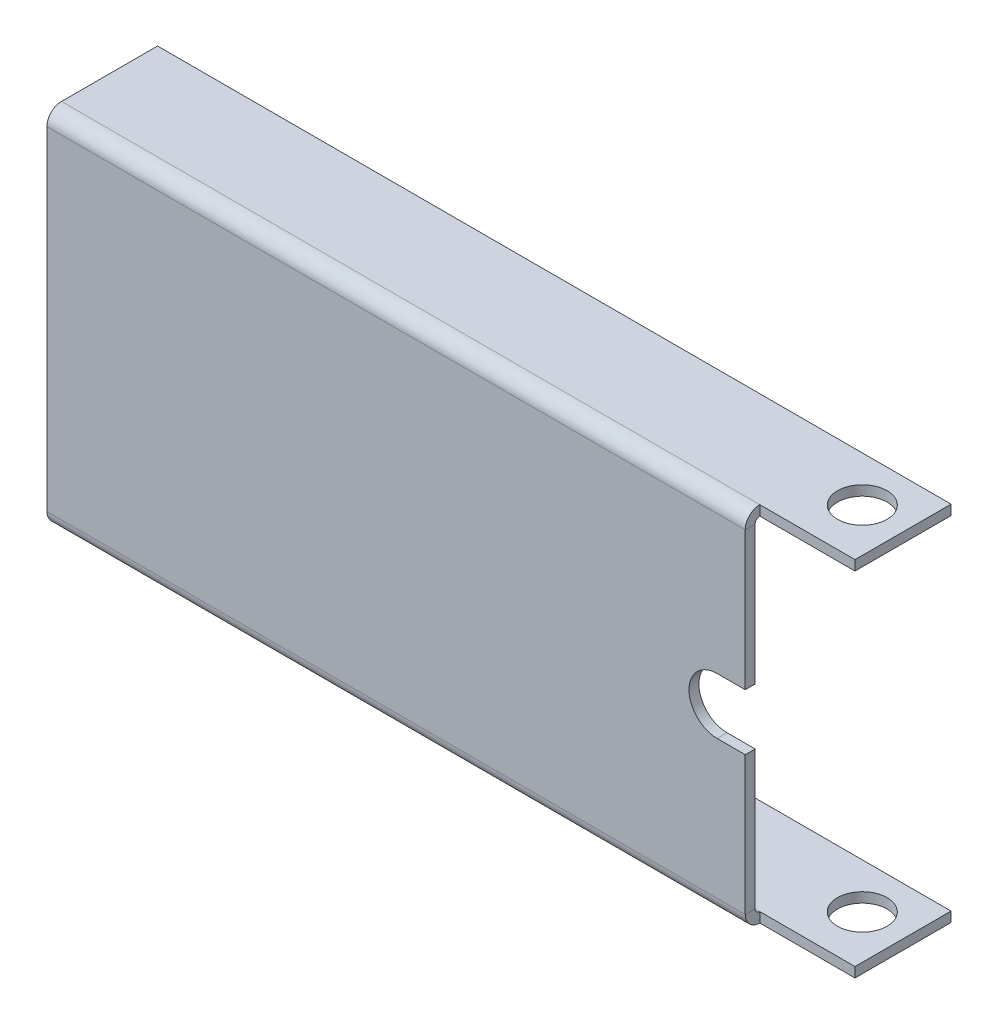
ISO-10303-21;
HEADER;
FILE_DESCRIPTION(('STEP AP214'),'2;1');
FILE_NAME('part.step','',(''),(''),'','','');
FILE_SCHEMA(('AUTOMOTIVE_DESIGN { 1 0 10303 214 1 1 1 1 }'));
ENDSEC;
DATA;
#1=APPLICATION_CONTEXT('core data for automotive mechanical design processes');
#2=APPLICATION_PROTOCOL_DEFINITION('international standard','automotive_design',2000,#1);
#3=PRODUCT_CONTEXT('',#1,'mechanical');
#4=PRODUCT('Part','Part','',(#3));
#5=PRODUCT_RELATED_PRODUCT_CATEGORY('part','',(#4));
#6=PRODUCT_DEFINITION_FORMATION('','',#4);
#7=PRODUCT_DEFINITION_CONTEXT('part definition',#1,'design');
#8=PRODUCT_DEFINITION('design','',#6,#7);
#9=PRODUCT_DEFINITION_SHAPE('','',#8);
#10=(LENGTH_UNIT() NAMED_UNIT(*) SI_UNIT(.MILLI.,.METRE.));
#11=(NAMED_UNIT(*) PLANE_ANGLE_UNIT() SI_UNIT($,.RADIAN.));
#12=(NAMED_UNIT(*) SI_UNIT($,.STERADIAN.) SOLID_ANGLE_UNIT());
#13=UNCERTAINTY_MEASURE_WITH_UNIT(LENGTH_MEASURE(1.E-05),#10,'distance_accuracy_value','');
#14=(GEOMETRIC_REPRESENTATION_CONTEXT(3) GLOBAL_UNCERTAINTY_ASSIGNED_CONTEXT((#13)) GLOBAL_UNIT_ASSIGNED_CONTEXT((#10,
#11,#12)) REPRESENTATION_CONTEXT('',''));
#15=CARTESIAN_POINT('',(0.,0.,0.));
#16=DIRECTION('',(0.,0.,1.));
#17=DIRECTION('',(1.,0.,0.));
#18=AXIS2_PLACEMENT_3D('',#15,#16,#17);
#19=CARTESIAN_POINT('',(0.,0.,-1.5875));
#20=DIRECTION('',(0.,0.,-1.));
#21=DIRECTION('',(-1.,0.,0.));
#22=AXIS2_PLACEMENT_3D('',#19,#20,#21);
#23=PLANE('',#22);
#24=DIRECTION('',(0.,1.,0.));
#25=VECTOR('',#24,1.);
#26=CARTESIAN_POINT('',(48.26,0.,-1.58749999999989));
#27=LINE('',#26,#25);
#28=CARTESIAN_POINT('',(48.26,26.67,-1.5875));
#29=VERTEX_POINT('',#28);
#30=CARTESIAN_POINT('',(48.26,4.5,-1.58749999999998));
#31=VERTEX_POINT('',#30);
#32=EDGE_CURVE('E228',#29,#31,#27,.F.);
#33=ORIENTED_EDGE('',*,*,#32,.T.);
#34=DIRECTION('',(-1.,0.,0.));
#35=VECTOR('',#34,1.);
#36=CARTESIAN_POINT('',(0.,4.5,-1.5875));
#37=LINE('',#36,#35);
#38=CARTESIAN_POINT('',(43.76,4.5,-1.5875));
#39=VERTEX_POINT('',#38);
#40=EDGE_CURVE('E201',#31,#39,#37,.T.);
#41=ORIENTED_EDGE('',*,*,#40,.T.);
#42=CARTESIAN_POINT('',(43.76,0.,-1.5875));
#43=DIRECTION('',(0.,0.,-1.));
#44=DIRECTION('',(-1.,0.,0.));
#45=AXIS2_PLACEMENT_3D('',#42,#43,#44);
#46=CIRCLE('',#45,4.5);
#47=CARTESIAN_POINT('',(43.76,-4.5,-1.5875));
#48=VERTEX_POINT('',#47);
#49=EDGE_CURVE('E204',#48,#39,#46,.T.);
#50=ORIENTED_EDGE('',*,*,#49,.F.);
#51=DIRECTION('',(-1.,0.,0.));
#52=VECTOR('',#51,1.);
#53=CARTESIAN_POINT('',(0.,-4.5,-1.5875));
#54=LINE('',#53,#52);
#55=CARTESIAN_POINT('',(48.26,-4.5,-1.58749999999998));
#56=VERTEX_POINT('',#55);
#57=EDGE_CURVE('E178',#56,#48,#54,.T.);
#58=ORIENTED_EDGE('',*,*,#57,.F.);
#59=CARTESIAN_POINT('',(48.26,-26.67,-1.5875));
#60=VERTEX_POINT('',#59);
#61=EDGE_CURVE('E227',#56,#60,#27,.F.);
#62=ORIENTED_EDGE('',*,*,#61,.T.);
#63=DIRECTION('',(-1.,0.,0.));
#64=VECTOR('',#63,1.);
#65=CARTESIAN_POINT('',(0.,-26.67,-1.5875));
#66=LINE('',#65,#64);
#67=CARTESIAN_POINT('',(-63.5,-26.67,-1.5875));
#68=VERTEX_POINT('',#67);
#69=EDGE_CURVE('E333',#60,#68,#66,.T.);
#70=ORIENTED_EDGE('',*,*,#69,.T.);
#71=DIRECTION('',(0.,-1.,0.));
#72=VECTOR('',#71,1.);
#73=CARTESIAN_POINT('',(-63.5,44.4500000000001,-1.5875));
#74=LINE('',#73,#72);
#75=CARTESIAN_POINT('',(-63.5,26.67,-1.5875));
#76=VERTEX_POINT('',#75);
#77=EDGE_CURVE('E328',#76,#68,#74,.T.);
#78=ORIENTED_EDGE('',*,*,#77,.F.);
#79=DIRECTION('',(-1.,0.,0.));
#80=VECTOR('',#79,1.);
#81=CARTESIAN_POINT('',(0.,26.67,-1.5875));
#82=LINE('',#81,#80);
#83=EDGE_CURVE('E325',#29,#76,#82,.T.);
#84=ORIENTED_EDGE('',*,*,#83,.F.);
#85=EDGE_LOOP('',(#33,#41,#50,#58,#62,#70,#78,#84));
#86=FACE_BOUND('',#85,.T.);
#87=ADVANCED_FACE('F51',(#86),#23,.T.);
#88=CARTESIAN_POINT('',(0.,0.,0.));
#89=DIRECTION('',(0.,0.,-1.));
#90=DIRECTION('',(-1.,0.,0.));
#91=AXIS2_PLACEMENT_3D('',#88,#89,#90);
#92=PLANE('',#91);
#93=DIRECTION('',(1.,0.,0.));
#94=VECTOR('',#93,1.);
#95=CARTESIAN_POINT('',(0.,4.5,0.));
#96=LINE('',#95,#94);
#97=CARTESIAN_POINT('',(43.76,4.5,0.));
#98=VERTEX_POINT('',#97);
#99=CARTESIAN_POINT('',(48.26,4.5,0.));
#100=VERTEX_POINT('',#99);
#101=EDGE_CURVE('E182',#98,#100,#96,.T.);
#102=ORIENTED_EDGE('',*,*,#101,.T.);
#103=DIRECTION('',(0.,-1.,0.));
#104=VECTOR('',#103,1.);
#105=CARTESIAN_POINT('',(48.26,-27.4066000000001,1.11022302462516E-13));
#106=LINE('',#105,#104);
#107=CARTESIAN_POINT('',(48.26,26.67,0.));
#108=VERTEX_POINT('',#107);
#109=EDGE_CURVE('E221',#108,#100,#106,.T.);
#110=ORIENTED_EDGE('',*,*,#109,.F.);
#111=DIRECTION('',(-1.,0.,0.));
#112=VECTOR('',#111,1.);
#113=CARTESIAN_POINT('',(0.,26.67,0.));
#114=LINE('',#113,#112);
#115=CARTESIAN_POINT('',(-63.5,26.67,0.));
#116=VERTEX_POINT('',#115);
#117=EDGE_CURVE('E331',#108,#116,#114,.T.);
#118=ORIENTED_EDGE('',*,*,#117,.T.);
#119=DIRECTION('',(0.,-1.,0.));
#120=VECTOR('',#119,1.);
#121=CARTESIAN_POINT('',(-63.5,44.4500000000001,0.));
#122=LINE('',#121,#120);
#123=CARTESIAN_POINT('',(-63.5,-26.6699999999999,0.));
#124=VERTEX_POINT('',#123);
#125=EDGE_CURVE('E322',#116,#124,#122,.T.);
#126=ORIENTED_EDGE('',*,*,#125,.T.);
#127=DIRECTION('',(-1.,0.,0.));
#128=VECTOR('',#127,1.);
#129=CARTESIAN_POINT('',(0.,-26.67,0.));
#130=LINE('',#129,#128);
#131=CARTESIAN_POINT('',(48.26,-26.67,0.));
#132=VERTEX_POINT('',#131);
#133=EDGE_CURVE('E335',#132,#124,#130,.T.);
#134=ORIENTED_EDGE('',*,*,#133,.F.);
#135=CARTESIAN_POINT('',(48.26,-4.5,1.11022302462516E-13));
#136=VERTEX_POINT('',#135);
#137=EDGE_CURVE('E195',#136,#132,#106,.T.);
#138=ORIENTED_EDGE('',*,*,#137,.F.);
#139=DIRECTION('',(1.,0.,0.));
#140=VECTOR('',#139,1.);
#141=CARTESIAN_POINT('',(0.,-4.5,0.));
#142=LINE('',#141,#140);
#143=CARTESIAN_POINT('',(43.76,-4.5,0.));
#144=VERTEX_POINT('',#143);
#145=EDGE_CURVE('E66',#144,#136,#142,.T.);
#146=ORIENTED_EDGE('',*,*,#145,.F.);
#147=CARTESIAN_POINT('',(43.76,0.,0.));
#148=DIRECTION('',(0.,0.,1.));
#149=DIRECTION('',(1.,0.,0.));
#150=AXIS2_PLACEMENT_3D('',#147,#148,#149);
#151=CIRCLE('',#150,4.5);
#152=EDGE_CURVE('E185',#98,#144,#151,.T.);
#153=ORIENTED_EDGE('',*,*,#152,.F.);
#154=EDGE_LOOP('',(#102,#110,#118,#126,#134,#138,#146,#153));
#155=FACE_BOUND('',#154,.T.);
#156=ADVANCED_FACE('F193',(#155),#92,.F.);
#157=CARTESIAN_POINT('',(48.26,-27.4066000000001,1.11022302462516E-13));
#158=DIRECTION('',(1.,0.,0.));
#159=DIRECTION('',(0.,-1.,0.));
#160=AXIS2_PLACEMENT_3D('',#157,#158,#159);
#161=PLANE('',#160);
#162=ORIENTED_EDGE('',*,*,#109,.T.);
#163=DIRECTION('',(0.,0.,-1.));
#164=VECTOR('',#163,1.);
#165=CARTESIAN_POINT('',(48.26,4.5,1.11022302462516E-13));
#166=LINE('',#165,#164);
#167=EDGE_CURVE('E12',#100,#31,#166,.T.);
#168=ORIENTED_EDGE('',*,*,#167,.T.);
#169=ORIENTED_EDGE('',*,*,#32,.F.);
#170=DIRECTION('',(0.,0.,1.));
#171=VECTOR('',#170,1.);
#172=CARTESIAN_POINT('',(48.26,26.67,-1.58749999999989));
#173=LINE('',#172,#171);
#174=EDGE_CURVE('E218',#29,#108,#173,.T.);
#175=ORIENTED_EDGE('',*,*,#174,.T.);
#176=EDGE_LOOP('',(#162,#168,#169,#175));
#177=FACE_BOUND('',#176,.T.);
#178=ADVANCED_FACE('F375',(#177),#161,.T.);
#179=CARTESIAN_POINT('',(-127.032667996758,26.67,-2.3241));
#180=DIRECTION('',(1.,0.,0.));
#181=DIRECTION('',(0.,1.,0.));
#182=AXIS2_PLACEMENT_3D('',#179,#180,#181);
#183=CYLINDRICAL_SURFACE('',#182,0.7366);
#184=DIRECTION('',(-1.,0.,0.));
#185=VECTOR('',#184,1.);
#186=CARTESIAN_POINT('',(0.,27.4066,-2.3241));
#187=LINE('',#186,#185);
#188=CARTESIAN_POINT('',(48.26,27.4066,-2.3241));
#189=VERTEX_POINT('',#188);
#190=CARTESIAN_POINT('',(-63.5,27.4066,-2.3241));
#191=VERTEX_POINT('',#190);
#192=EDGE_CURVE('E311',#189,#191,#187,.T.);
#193=ORIENTED_EDGE('',*,*,#192,.F.);
#194=CARTESIAN_POINT('',(48.26,26.67,-2.3241));
#195=DIRECTION('',(1.,0.,0.));
#196=DIRECTION('',(0.,0.,-1.));
#197=AXIS2_PLACEMENT_3D('',#194,#195,#196);
#198=CIRCLE('',#197,0.7366);
#199=EDGE_CURVE('E242',#189,#29,#198,.T.);
#200=ORIENTED_EDGE('',*,*,#199,.T.);
#201=ORIENTED_EDGE('',*,*,#83,.T.);
#202=CARTESIAN_POINT('',(-63.5,26.67,-2.3241));
#203=DIRECTION('',(-1.,0.,0.));
#204=DIRECTION('',(0.,0.,-1.));
#205=AXIS2_PLACEMENT_3D('',#202,#203,#204);
#206=CIRCLE('',#205,0.7366);
#207=EDGE_CURVE('E319',#76,#191,#206,.T.);
#208=ORIENTED_EDGE('',*,*,#207,.T.);
#209=EDGE_LOOP('',(#193,#200,#201,#208));
#210=FACE_BOUND('',#209,.T.);
#211=ADVANCED_FACE('F372',(#210),#183,.F.);
#212=CARTESIAN_POINT('',(-127.032667996758,26.67,-2.3241));
#213=DIRECTION('',(1.,0.,0.));
#214=DIRECTION('',(0.,1.,0.));
#215=AXIS2_PLACEMENT_3D('',#212,#213,#214);
#216=CYLINDRICAL_SURFACE('',#215,2.3241);
#217=CARTESIAN_POINT('',(48.26,26.67,-2.3241));
#218=DIRECTION('',(-1.,0.,0.));
#219=DIRECTION('',(0.,-1.,0.));
#220=AXIS2_PLACEMENT_3D('',#217,#218,#219);
#221=CIRCLE('',#220,2.3241);
#222=CARTESIAN_POINT('',(48.26,28.9941,-2.32410000000001));
#223=VERTEX_POINT('',#222);
#224=EDGE_CURVE('E240',#223,#108,#221,.F.);
#225=ORIENTED_EDGE('',*,*,#224,.F.);
#226=DIRECTION('',(-1.,0.,0.));
#227=VECTOR('',#226,1.);
#228=CARTESIAN_POINT('',(0.,28.9941,-2.32410000000001));
#229=LINE('',#228,#227);
#230=CARTESIAN_POINT('',(-63.5,28.9941,-2.3241));
#231=VERTEX_POINT('',#230);
#232=EDGE_CURVE('E282',#223,#231,#229,.T.);
#233=ORIENTED_EDGE('',*,*,#232,.T.);
#234=CARTESIAN_POINT('',(-63.5,26.67,-2.3241));
#235=DIRECTION('',(1.,0.,0.));
#236=DIRECTION('',(0.,1.,0.));
#237=AXIS2_PLACEMENT_3D('',#234,#235,#236);
#238=CIRCLE('',#237,2.3241);
#239=EDGE_CURVE('E288',#116,#231,#238,.F.);
#240=ORIENTED_EDGE('',*,*,#239,.F.);
#241=ORIENTED_EDGE('',*,*,#117,.F.);
#242=EDGE_LOOP('',(#225,#233,#240,#241));
#243=FACE_BOUND('',#242,.T.);
#244=ADVANCED_FACE('F384',(#243),#216,.T.);
#245=CARTESIAN_POINT('',(127.032667996758,-26.67,-2.3241));
#246=DIRECTION('',(-1.,0.,0.));
#247=DIRECTION('',(0.,-1.,0.));
#248=AXIS2_PLACEMENT_3D('',#245,#246,#247);
#249=CYLINDRICAL_SURFACE('',#248,0.7366);
#250=ORIENTED_EDGE('',*,*,#69,.F.);
#251=CARTESIAN_POINT('',(48.26,-26.67,-2.32409999999999));
#252=DIRECTION('',(1.,0.,0.));
#253=DIRECTION('',(0.,1.,0.));
#254=AXIS2_PLACEMENT_3D('',#251,#252,#253);
#255=CIRCLE('',#254,0.736599999999995);
#256=CARTESIAN_POINT('',(48.26,-27.4066,-2.32409999999997));
#257=VERTEX_POINT('',#256);
#258=EDGE_CURVE('E234',#60,#257,#255,.T.);
#259=ORIENTED_EDGE('',*,*,#258,.T.);
#260=DIRECTION('',(-1.,0.,0.));
#261=VECTOR('',#260,1.);
#262=CARTESIAN_POINT('',(0.,-27.4066,-2.32409999999997));
#263=LINE('',#262,#261);
#264=CARTESIAN_POINT('',(-63.5,-27.4065999999999,-2.3241));
#265=VERTEX_POINT('',#264);
#266=EDGE_CURVE('E245',#257,#265,#263,.T.);
#267=ORIENTED_EDGE('',*,*,#266,.T.);
#268=CARTESIAN_POINT('',(-63.5,-26.6699999999999,-2.3241));
#269=DIRECTION('',(-1.,0.,0.));
#270=DIRECTION('',(0.,0.,-1.));
#271=AXIS2_PLACEMENT_3D('',#268,#269,#270);
#272=CIRCLE('',#271,0.7366);
#273=EDGE_CURVE('E279',#265,#68,#272,.T.);
#274=ORIENTED_EDGE('',*,*,#273,.T.);
#275=EDGE_LOOP('',(#250,#259,#267,#274));
#276=FACE_BOUND('',#275,.T.);
#277=ADVANCED_FACE('F353',(#276),#249,.F.);
#278=CARTESIAN_POINT('',(127.032667996758,-26.67,-2.3241));
#279=DIRECTION('',(-1.,0.,0.));
#280=DIRECTION('',(0.,-1.,0.));
#281=AXIS2_PLACEMENT_3D('',#278,#279,#280);
#282=CYLINDRICAL_SURFACE('',#281,2.3241);
#283=CARTESIAN_POINT('',(48.26,-26.67,-2.32409999999999));
#284=DIRECTION('',(-1.,0.,0.));
#285=DIRECTION('',(0.,-1.,0.));
#286=AXIS2_PLACEMENT_3D('',#283,#284,#285);
#287=CIRCLE('',#286,2.3241);
#288=CARTESIAN_POINT('',(48.26,-28.9941,-2.32409999999997));
#289=VERTEX_POINT('',#288);
#290=EDGE_CURVE('E231',#132,#289,#287,.F.);
#291=ORIENTED_EDGE('',*,*,#290,.F.);
#292=ORIENTED_EDGE('',*,*,#133,.T.);
#293=CARTESIAN_POINT('',(-63.5,-26.6699999999999,-2.3241));
#294=DIRECTION('',(-1.,0.,0.));
#295=DIRECTION('',(0.,-1.,0.));
#296=AXIS2_PLACEMENT_3D('',#293,#294,#295);
#297=CIRCLE('',#296,2.3241);
#298=CARTESIAN_POINT('',(-63.5,-28.9941,-2.32409999999997));
#299=VERTEX_POINT('',#298);
#300=EDGE_CURVE('E249',#299,#124,#297,.T.);
#301=ORIENTED_EDGE('',*,*,#300,.F.);
#302=DIRECTION('',(-1.,0.,0.));
#303=VECTOR('',#302,1.);
#304=CARTESIAN_POINT('',(0.,-28.9941,-2.32409999999997));
#305=LINE('',#304,#303);
#306=EDGE_CURVE('E260',#289,#299,#305,.T.);
#307=ORIENTED_EDGE('',*,*,#306,.F.);
#308=EDGE_LOOP('',(#291,#292,#301,#307));
#309=FACE_BOUND('',#308,.T.);
#310=ADVANCED_FACE('F443',(#309),#282,.T.);
#311=CARTESIAN_POINT('',(-63.5,44.4500000000001,-1.5875));
#312=DIRECTION('',(-1.,0.,0.));
#313=DIRECTION('',(0.,-1.,0.));
#314=AXIS2_PLACEMENT_3D('',#311,#312,#313);
#315=PLANE('',#314);
#316=ORIENTED_EDGE('',*,*,#77,.T.);
#317=DIRECTION('',(0.,0.,1.));
#318=VECTOR('',#317,1.);
#319=CARTESIAN_POINT('',(-63.5,-26.6699999999999,-1.5875));
#320=LINE('',#319,#318);
#321=EDGE_CURVE('E337',#68,#124,#320,.T.);
#322=ORIENTED_EDGE('',*,*,#321,.T.);
#323=ORIENTED_EDGE('',*,*,#125,.F.);
#324=DIRECTION('',(0.,0.,1.));
#325=VECTOR('',#324,1.);
#326=CARTESIAN_POINT('',(-63.5,26.67,-1.5875));
#327=LINE('',#326,#325);
#328=EDGE_CURVE('E327',#76,#116,#327,.T.);
#329=ORIENTED_EDGE('',*,*,#328,.F.);
#330=EDGE_LOOP('',(#316,#322,#323,#329));
#331=FACE_BOUND('',#330,.T.);
#332=ADVANCED_FACE('F53',(#331),#315,.T.);
#333=CARTESIAN_POINT('',(-63.5,26.67,-2.3241));
#334=DIRECTION('',(1.,0.,0.));
#335=DIRECTION('',(0.,0.,-1.));
#336=AXIS2_PLACEMENT_3D('',#333,#334,#335);
#337=PLANE('',#336);
#338=ORIENTED_EDGE('',*,*,#239,.T.);
#339=DIRECTION('',(0.,1.,0.));
#340=VECTOR('',#339,1.);
#341=CARTESIAN_POINT('',(-63.5,27.4066,-2.3241));
#342=LINE('',#341,#340);
#343=EDGE_CURVE('E302',#191,#231,#342,.T.);
#344=ORIENTED_EDGE('',*,*,#343,.F.);
#345=ORIENTED_EDGE('',*,*,#207,.F.);
#346=ORIENTED_EDGE('',*,*,#328,.T.);
#347=EDGE_LOOP('',(#338,#344,#345,#346));
#348=FACE_BOUND('',#347,.T.);
#349=ADVANCED_FACE('F369',(#348),#337,.F.);
#350=CARTESIAN_POINT('',(63.5,27.4065999999999,-17.7002318412895));
#351=DIRECTION('',(0.,0.,-1.));
#352=DIRECTION('',(-1.,0.,0.));
#353=AXIS2_PLACEMENT_3D('',#350,#351,#352);
#354=PLANE('',#353);
#355=DIRECTION('',(-1.,0.,0.));
#356=VECTOR('',#355,1.);
#357=CARTESIAN_POINT('',(63.5,28.9940999999999,-17.7002318412895));
#358=LINE('',#357,#356);
#359=CARTESIAN_POINT('',(63.5,28.9940999999999,-17.7002318412895));
#360=VERTEX_POINT('',#359);
#361=CARTESIAN_POINT('',(-63.5,28.9940999999999,-17.7002318412895));
#362=VERTEX_POINT('',#361);
#363=EDGE_CURVE('E297',#360,#362,#358,.T.);
#364=ORIENTED_EDGE('',*,*,#363,.F.);
#365=DIRECTION('',(0.,1.,0.));
#366=VECTOR('',#365,1.);
#367=CARTESIAN_POINT('',(63.5,27.4065999999999,-17.7002318412895));
#368=LINE('',#367,#366);
#369=CARTESIAN_POINT('',(63.5,27.4065999999999,-17.7002318412895));
#370=VERTEX_POINT('',#369);
#371=EDGE_CURVE('E285',#370,#360,#368,.T.);
#372=ORIENTED_EDGE('',*,*,#371,.F.);
#373=DIRECTION('',(-1.,0.,0.));
#374=VECTOR('',#373,1.);
#375=CARTESIAN_POINT('',(63.5,27.4065999999999,-17.7002318412895));
#376=LINE('',#375,#374);
#377=CARTESIAN_POINT('',(-63.5,27.4065999999999,-17.7002318412895));
#378=VERTEX_POINT('',#377);
#379=EDGE_CURVE('E314',#370,#378,#376,.T.);
#380=ORIENTED_EDGE('',*,*,#379,.T.);
#381=DIRECTION('',(0.,1.,0.));
#382=VECTOR('',#381,1.);
#383=CARTESIAN_POINT('',(-63.5,27.4065999999999,-17.7002318412895));
#384=LINE('',#383,#382);
#385=EDGE_CURVE('E312',#378,#362,#384,.T.);
#386=ORIENTED_EDGE('',*,*,#385,.T.);
#387=EDGE_LOOP('',(#364,#372,#380,#386));
#388=FACE_BOUND('',#387,.T.);
#389=ADVANCED_FACE('F399',(#388),#354,.T.);
#390=CARTESIAN_POINT('',(0.,27.4066000000001,26.7497681587106));
#391=DIRECTION('',(0.,-1.,0.));
#392=DIRECTION('',(-1.,0.,0.));
#393=AXIS2_PLACEMENT_3D('',#390,#391,#392);
#394=PLANE('',#393);
#395=CARTESIAN_POINT('',(56.515,27.4066,-10.4775));
#396=DIRECTION('',(0.,-1.,0.));
#397=DIRECTION('',(0.,0.,-1.));
#398=AXIS2_PLACEMENT_3D('',#395,#396,#397);
#399=CIRCLE('',#398,3.96875);
#400=CARTESIAN_POINT('',(56.515,27.4065999999999,-14.44625));
#401=VERTEX_POINT('',#400);
#402=EDGE_CURVE('E215',#401,#401,#399,.T.);
#403=ORIENTED_EDGE('',*,*,#402,.F.);
#404=EDGE_LOOP('',(#403));
#405=FACE_BOUND('',#404,.T.);
#406=DIRECTION('',(0.,0.,-1.));
#407=VECTOR('',#406,1.);
#408=CARTESIAN_POINT('',(63.5,27.4065999999999,-17.7002318412895));
#409=LINE('',#408,#407);
#410=CARTESIAN_POINT('',(63.5,27.4066,-2.3241));
#411=VERTEX_POINT('',#410);
#412=EDGE_CURVE('E289',#411,#370,#409,.T.);
#413=ORIENTED_EDGE('',*,*,#412,.F.);
#414=EDGE_CURVE('E308',#411,#189,#187,.T.);
#415=ORIENTED_EDGE('',*,*,#414,.T.);
#416=ORIENTED_EDGE('',*,*,#192,.T.);
#417=DIRECTION('',(0.,0.,1.));
#418=VECTOR('',#417,1.);
#419=CARTESIAN_POINT('',(-63.5,27.4065999999999,-17.7002318412895));
#420=LINE('',#419,#418);
#421=EDGE_CURVE('E305',#378,#191,#420,.T.);
#422=ORIENTED_EDGE('',*,*,#421,.F.);
#423=ORIENTED_EDGE('',*,*,#379,.F.);
#424=EDGE_LOOP('',(#413,#415,#416,#422,#423));
#425=FACE_BOUND('',#424,.T.);
#426=ADVANCED_FACE('F396',(#405,#425),#394,.T.);
#427=CARTESIAN_POINT('',(-63.5,27.4065999999999,-17.7002318412895));
#428=DIRECTION('',(-1.,0.,0.));
#429=DIRECTION('',(0.,0.,1.));
#430=AXIS2_PLACEMENT_3D('',#427,#428,#429);
#431=PLANE('',#430);
#432=ORIENTED_EDGE('',*,*,#421,.T.);
#433=ORIENTED_EDGE('',*,*,#343,.T.);
#434=DIRECTION('',(0.,0.,1.));
#435=VECTOR('',#434,1.);
#436=CARTESIAN_POINT('',(-63.5,28.9940999999999,-17.7002318412895));
#437=LINE('',#436,#435);
#438=EDGE_CURVE('E294',#362,#231,#437,.T.);
#439=ORIENTED_EDGE('',*,*,#438,.F.);
#440=ORIENTED_EDGE('',*,*,#385,.F.);
#441=EDGE_LOOP('',(#432,#433,#439,#440));
#442=FACE_BOUND('',#441,.T.);
#443=ADVANCED_FACE('F391',(#442),#431,.T.);
#444=CARTESIAN_POINT('',(0.,28.9941000000001,26.7497681587105));
#445=DIRECTION('',(0.,-1.,0.));
#446=DIRECTION('',(-1.,0.,0.));
#447=AXIS2_PLACEMENT_3D('',#444,#445,#446);
#448=PLANE('',#447);
#449=CARTESIAN_POINT('',(56.515,28.9940999999999,-10.4775));
#450=DIRECTION('',(0.,1.,0.));
#451=DIRECTION('',(0.,0.,1.));
#452=AXIS2_PLACEMENT_3D('',#449,#450,#451);
#453=CIRCLE('',#452,3.96875);
#454=CARTESIAN_POINT('',(56.515,28.9941,-6.50875000000002));
#455=VERTEX_POINT('',#454);
#456=EDGE_CURVE('E206',#455,#455,#453,.T.);
#457=ORIENTED_EDGE('',*,*,#456,.F.);
#458=EDGE_LOOP('',(#457));
#459=FACE_BOUND('',#458,.T.);
#460=CARTESIAN_POINT('',(63.5,28.9941,-2.32410000000002));
#461=VERTEX_POINT('',#460);
#462=EDGE_CURVE('E317',#461,#223,#229,.T.);
#463=ORIENTED_EDGE('',*,*,#462,.F.);
#464=DIRECTION('',(0.,0.,-1.));
#465=VECTOR('',#464,1.);
#466=CARTESIAN_POINT('',(63.5,28.9940999999999,-17.7002318412895));
#467=LINE('',#466,#465);
#468=EDGE_CURVE('E300',#461,#360,#467,.T.);
#469=ORIENTED_EDGE('',*,*,#468,.T.);
#470=ORIENTED_EDGE('',*,*,#363,.T.);
#471=ORIENTED_EDGE('',*,*,#438,.T.);
#472=ORIENTED_EDGE('',*,*,#232,.F.);
#473=EDGE_LOOP('',(#463,#469,#470,#471,#472));
#474=FACE_BOUND('',#473,.T.);
#475=ADVANCED_FACE('F387',(#459,#474),#448,.F.);
#476=CARTESIAN_POINT('',(63.5,27.4065999999999,-17.7002318412895));
#477=DIRECTION('',(1.,0.,0.));
#478=DIRECTION('',(0.,0.,-1.));
#479=AXIS2_PLACEMENT_3D('',#476,#477,#478);
#480=PLANE('',#479);
#481=ORIENTED_EDGE('',*,*,#468,.F.);
#482=DIRECTION('',(0.,-1.,0.));
#483=VECTOR('',#482,1.);
#484=CARTESIAN_POINT('',(63.5,27.4066,-2.3241));
#485=LINE('',#484,#483);
#486=EDGE_CURVE('E291',#461,#411,#485,.T.);
#487=ORIENTED_EDGE('',*,*,#486,.T.);
#488=ORIENTED_EDGE('',*,*,#412,.T.);
#489=ORIENTED_EDGE('',*,*,#371,.T.);
#490=EDGE_LOOP('',(#481,#487,#488,#489));
#491=FACE_BOUND('',#490,.T.);
#492=ADVANCED_FACE('F402',(#491),#480,.T.);
#493=CARTESIAN_POINT('',(-63.5,-26.6699999999999,-2.3241));
#494=DIRECTION('',(1.,0.,0.));
#495=DIRECTION('',(0.,0.,-1.));
#496=AXIS2_PLACEMENT_3D('',#493,#494,#495);
#497=PLANE('',#496);
#498=DIRECTION('',(0.,-1.,0.));
#499=VECTOR('',#498,1.);
#500=CARTESIAN_POINT('',(-63.5,-27.4066,-2.32409999999996));
#501=LINE('',#500,#499);
#502=EDGE_CURVE('E274',#265,#299,#501,.T.);
#503=ORIENTED_EDGE('',*,*,#502,.T.);
#504=ORIENTED_EDGE('',*,*,#300,.T.);
#505=ORIENTED_EDGE('',*,*,#321,.F.);
#506=ORIENTED_EDGE('',*,*,#273,.F.);
#507=EDGE_LOOP('',(#503,#504,#505,#506));
#508=FACE_BOUND('',#507,.T.);
#509=ADVANCED_FACE('F361',(#508),#497,.F.);
#510=CARTESIAN_POINT('',(63.5,-27.4066,-17.7002318412893));
#511=DIRECTION('',(0.,0.,-1.));
#512=DIRECTION('',(1.,0.,0.));
#513=AXIS2_PLACEMENT_3D('',#510,#511,#512);
#514=PLANE('',#513);
#515=DIRECTION('',(1.,0.,0.));
#516=VECTOR('',#515,1.);
#517=CARTESIAN_POINT('',(63.5,-28.9941,-17.7002318412893));
#518=LINE('',#517,#516);
#519=CARTESIAN_POINT('',(-63.5,-28.9940999999999,-17.7002318412894));
#520=VERTEX_POINT('',#519);
#521=CARTESIAN_POINT('',(63.5,-28.9941,-17.7002318412893));
#522=VERTEX_POINT('',#521);
#523=EDGE_CURVE('E252',#520,#522,#518,.T.);
#524=ORIENTED_EDGE('',*,*,#523,.F.);
#525=DIRECTION('',(0.,-1.,0.));
#526=VECTOR('',#525,1.);
#527=CARTESIAN_POINT('',(-63.5,-27.4065999999999,-17.7002318412894));
#528=LINE('',#527,#526);
#529=CARTESIAN_POINT('',(-63.5,-27.4065999999999,-17.7002318412894));
#530=VERTEX_POINT('',#529);
#531=EDGE_CURVE('E246',#530,#520,#528,.T.);
#532=ORIENTED_EDGE('',*,*,#531,.F.);
#533=DIRECTION('',(1.,0.,0.));
#534=VECTOR('',#533,1.);
#535=CARTESIAN_POINT('',(63.5,-27.4066,-17.7002318412893));
#536=LINE('',#535,#534);
#537=CARTESIAN_POINT('',(63.5,-27.4066,-17.7002318412893));
#538=VERTEX_POINT('',#537);
#539=EDGE_CURVE('E269',#530,#538,#536,.T.);
#540=ORIENTED_EDGE('',*,*,#539,.T.);
#541=DIRECTION('',(0.,-1.,0.));
#542=VECTOR('',#541,1.);
#543=CARTESIAN_POINT('',(63.5,-27.4066,-17.7002318412893));
#544=LINE('',#543,#542);
#545=EDGE_CURVE('E267',#538,#522,#544,.T.);
#546=ORIENTED_EDGE('',*,*,#545,.T.);
#547=EDGE_LOOP('',(#524,#532,#540,#546));
#548=FACE_BOUND('',#547,.T.);
#549=ADVANCED_FACE('F442',(#548),#514,.T.);
#550=CARTESIAN_POINT('',(0.,-27.4066000000001,26.7497681587106));
#551=DIRECTION('',(0.,1.,0.));
#552=DIRECTION('',(-1.,0.,0.));
#553=AXIS2_PLACEMENT_3D('',#550,#551,#552);
#554=PLANE('',#553);
#555=CARTESIAN_POINT('',(56.515,-27.4066,-10.4774999999998));
#556=DIRECTION('',(0.,1.,0.));
#557=DIRECTION('',(0.,0.,1.));
#558=AXIS2_PLACEMENT_3D('',#555,#556,#557);
#559=CIRCLE('',#558,3.96875);
#560=CARTESIAN_POINT('',(56.515,-27.4066,-6.50874999999982));
#561=VERTEX_POINT('',#560);
#562=EDGE_CURVE('E212',#561,#561,#559,.T.);
#563=ORIENTED_EDGE('',*,*,#562,.F.);
#564=EDGE_LOOP('',(#563));
#565=FACE_BOUND('',#564,.T.);
#566=CARTESIAN_POINT('',(63.5,-27.4066,-2.32409999999993));
#567=VERTEX_POINT('',#566);
#568=EDGE_CURVE('E277',#567,#257,#263,.T.);
#569=ORIENTED_EDGE('',*,*,#568,.F.);
#570=DIRECTION('',(0.,0.,1.));
#571=VECTOR('',#570,1.);
#572=CARTESIAN_POINT('',(63.4999999999999,-27.4066000000003,71.1997681587107));
#573=LINE('',#572,#571);
#574=EDGE_CURVE('E264',#538,#567,#573,.T.);
#575=ORIENTED_EDGE('',*,*,#574,.F.);
#576=ORIENTED_EDGE('',*,*,#539,.F.);
#577=DIRECTION('',(0.,0.,-1.));
#578=VECTOR('',#577,1.);
#579=CARTESIAN_POINT('',(-63.5000000000001,-27.4066000000002,71.1997681587106));
#580=LINE('',#579,#578);
#581=EDGE_CURVE('E250',#265,#530,#580,.T.);
#582=ORIENTED_EDGE('',*,*,#581,.F.);
#583=ORIENTED_EDGE('',*,*,#266,.F.);
#584=EDGE_LOOP('',(#569,#575,#576,#582,#583));
#585=FACE_BOUND('',#584,.T.);
#586=ADVANCED_FACE('F459',(#565,#585),#554,.T.);
#587=CARTESIAN_POINT('',(63.4999999999999,-27.4066000000003,71.1997681587107));
#588=DIRECTION('',(1.,0.,0.));
#589=DIRECTION('',(0.,0.,1.));
#590=AXIS2_PLACEMENT_3D('',#587,#588,#589);
#591=PLANE('',#590);
#592=DIRECTION('',(0.,1.,0.));
#593=VECTOR('',#592,1.);
#594=CARTESIAN_POINT('',(63.5,-27.4066,-2.32409999999997));
#595=LINE('',#594,#593);
#596=CARTESIAN_POINT('',(63.5,-28.9941,-2.32409999999997));
#597=VERTEX_POINT('',#596);
#598=EDGE_CURVE('E272',#597,#567,#595,.T.);
#599=ORIENTED_EDGE('',*,*,#598,.F.);
#600=DIRECTION('',(0.,0.,1.));
#601=VECTOR('',#600,1.);
#602=CARTESIAN_POINT('',(63.4999999999999,-28.9941000000003,71.1997681587107));
#603=LINE('',#602,#601);
#604=EDGE_CURVE('E261',#522,#597,#603,.T.);
#605=ORIENTED_EDGE('',*,*,#604,.F.);
#606=ORIENTED_EDGE('',*,*,#545,.F.);
#607=ORIENTED_EDGE('',*,*,#574,.T.);
#608=EDGE_LOOP('',(#599,#605,#606,#607));
#609=FACE_BOUND('',#608,.T.);
#610=ADVANCED_FACE('F455',(#609),#591,.T.);
#611=CARTESIAN_POINT('',(0.,-28.9941000000001,26.7497681587106));
#612=DIRECTION('',(0.,1.,0.));
#613=DIRECTION('',(-1.,0.,0.));
#614=AXIS2_PLACEMENT_3D('',#611,#612,#613);
#615=PLANE('',#614);
#616=CARTESIAN_POINT('',(56.515,-28.9941,-10.4774999999998));
#617=DIRECTION('',(0.,1.,0.));
#618=DIRECTION('',(0.,0.,1.));
#619=AXIS2_PLACEMENT_3D('',#616,#617,#618);
#620=CIRCLE('',#619,3.96875);
#621=CARTESIAN_POINT('',(56.515,-28.9941,-6.50874999999981));
#622=VERTEX_POINT('',#621);
#623=EDGE_CURVE('E209',#622,#622,#620,.F.);
#624=ORIENTED_EDGE('',*,*,#623,.F.);
#625=EDGE_LOOP('',(#624));
#626=FACE_BOUND('',#625,.T.);
#627=ORIENTED_EDGE('',*,*,#604,.T.);
#628=EDGE_CURVE('E257',#597,#289,#305,.T.);
#629=ORIENTED_EDGE('',*,*,#628,.T.);
#630=ORIENTED_EDGE('',*,*,#306,.T.);
#631=DIRECTION('',(0.,0.,-1.));
#632=VECTOR('',#631,1.);
#633=CARTESIAN_POINT('',(-63.5000000000001,-28.9941000000002,71.1997681587106));
#634=LINE('',#633,#632);
#635=EDGE_CURVE('E255',#299,#520,#634,.T.);
#636=ORIENTED_EDGE('',*,*,#635,.T.);
#637=ORIENTED_EDGE('',*,*,#523,.T.);
#638=EDGE_LOOP('',(#627,#629,#630,#636,#637));
#639=FACE_BOUND('',#638,.T.);
#640=ADVANCED_FACE('F451',(#626,#639),#615,.F.);
#641=CARTESIAN_POINT('',(-63.5000000000001,-27.4066000000002,71.1997681587106));
#642=DIRECTION('',(-1.,0.,0.));
#643=DIRECTION('',(0.,0.,-1.));
#644=AXIS2_PLACEMENT_3D('',#641,#642,#643);
#645=PLANE('',#644);
#646=ORIENTED_EDGE('',*,*,#502,.F.);
#647=ORIENTED_EDGE('',*,*,#581,.T.);
#648=ORIENTED_EDGE('',*,*,#531,.T.);
#649=ORIENTED_EDGE('',*,*,#635,.F.);
#650=EDGE_LOOP('',(#646,#647,#648,#649));
#651=FACE_BOUND('',#650,.T.);
#652=ADVANCED_FACE('F414',(#651),#645,.T.);
#653=CARTESIAN_POINT('',(48.26,26.67,-2.3241));
#654=DIRECTION('',(-1.,0.,0.));
#655=DIRECTION('',(0.,0.,1.));
#656=AXIS2_PLACEMENT_3D('',#653,#654,#655);
#657=PLANE('',#656);
#658=DIRECTION('',(0.,1.,0.));
#659=VECTOR('',#658,1.);
#660=CARTESIAN_POINT('',(48.26,27.4066000000001,-2.3241));
#661=LINE('',#660,#659);
#662=EDGE_CURVE('E237',#189,#223,#661,.T.);
#663=ORIENTED_EDGE('',*,*,#662,.T.);
#664=ORIENTED_EDGE('',*,*,#224,.T.);
#665=ORIENTED_EDGE('',*,*,#174,.F.);
#666=ORIENTED_EDGE('',*,*,#199,.F.);
#667=EDGE_LOOP('',(#663,#664,#665,#666));
#668=FACE_BOUND('',#667,.T.);
#669=ADVANCED_FACE('F378',(#668),#657,.F.);
#670=CARTESIAN_POINT('',(55.88,27.4066,-2.3241));
#671=DIRECTION('',(0.,0.,-1.));
#672=DIRECTION('',(-1.,0.,0.));
#673=AXIS2_PLACEMENT_3D('',#670,#671,#672);
#674=PLANE('',#673);
#675=ORIENTED_EDGE('',*,*,#662,.F.);
#676=ORIENTED_EDGE('',*,*,#414,.F.);
#677=ORIENTED_EDGE('',*,*,#486,.F.);
#678=ORIENTED_EDGE('',*,*,#462,.T.);
#679=EDGE_LOOP('',(#675,#676,#677,#678));
#680=FACE_BOUND('',#679,.T.);
#681=ADVANCED_FACE('F404',(#680),#674,.F.);
#682=CARTESIAN_POINT('',(55.88,-27.4066000000002,-2.32409999999998));
#683=DIRECTION('',(0.,0.,1.));
#684=DIRECTION('',(-1.,0.,0.));
#685=AXIS2_PLACEMENT_3D('',#682,#683,#684);
#686=PLANE('',#685);
#687=ORIENTED_EDGE('',*,*,#598,.T.);
#688=ORIENTED_EDGE('',*,*,#568,.T.);
#689=DIRECTION('',(0.,-1.,1.00089258388553E-13));
#690=VECTOR('',#689,1.);
#691=CARTESIAN_POINT('',(48.26,-27.4066000000002,-2.32409999999994));
#692=LINE('',#691,#690);
#693=EDGE_CURVE('E74',#257,#289,#692,.T.);
#694=ORIENTED_EDGE('',*,*,#693,.T.);
#695=ORIENTED_EDGE('',*,*,#628,.F.);
#696=EDGE_LOOP('',(#687,#688,#694,#695));
#697=FACE_BOUND('',#696,.T.);
#698=ADVANCED_FACE('F406',(#697),#686,.T.);
#699=CARTESIAN_POINT('',(48.26,-26.67,-2.32409999999999));
#700=DIRECTION('',(-1.,0.,0.));
#701=DIRECTION('',(0.,-1.,0.));
#702=AXIS2_PLACEMENT_3D('',#699,#700,#701);
#703=PLANE('',#702);
#704=DIRECTION('',(0.,0.,1.));
#705=VECTOR('',#704,1.);
#706=CARTESIAN_POINT('',(48.26,-26.67,-1.58749999999989));
#707=LINE('',#706,#705);
#708=EDGE_CURVE('E224',#60,#132,#707,.T.);
#709=ORIENTED_EDGE('',*,*,#708,.T.);
#710=ORIENTED_EDGE('',*,*,#290,.T.);
#711=ORIENTED_EDGE('',*,*,#693,.F.);
#712=ORIENTED_EDGE('',*,*,#258,.F.);
#713=EDGE_LOOP('',(#709,#710,#711,#712));
#714=FACE_BOUND('',#713,.T.);
#715=ADVANCED_FACE('F412',(#714),#703,.F.);
#716=DIRECTION('',(0.,0.,-1.));
#717=VECTOR('',#716,1.);
#718=CARTESIAN_POINT('',(48.26,-4.5,1.11022302462516E-13));
#719=LINE('',#718,#717);
#720=EDGE_CURVE('E59',#136,#56,#719,.T.);
#721=ORIENTED_EDGE('',*,*,#720,.F.);
#722=ORIENTED_EDGE('',*,*,#137,.T.);
#723=ORIENTED_EDGE('',*,*,#708,.F.);
#724=ORIENTED_EDGE('',*,*,#61,.F.);
#725=EDGE_LOOP('',(#721,#722,#723,#724));
#726=FACE_BOUND('',#725,.T.);
#727=ADVANCED_FACE('F348',(#726),#161,.T.);
#728=CARTESIAN_POINT('',(56.515,-40.2194201513365,-10.4774999999998));
#729=DIRECTION('',(0.,1.,0.));
#730=DIRECTION('',(0.,0.,1.));
#731=AXIS2_PLACEMENT_3D('',#728,#729,#730);
#732=CYLINDRICAL_SURFACE('',#731,3.96875);
#733=ORIENTED_EDGE('',*,*,#562,.T.);
#734=EDGE_LOOP('',(#733));
#735=FACE_BOUND('',#734,.T.);
#736=ORIENTED_EDGE('',*,*,#623,.T.);
#737=EDGE_LOOP('',(#736));
#738=FACE_BOUND('',#737,.T.);
#739=ADVANCED_FACE('F493',(#735,#738),#732,.F.);
#740=ORIENTED_EDGE('',*,*,#402,.T.);
#741=EDGE_LOOP('',(#740));
#742=FACE_BOUND('',#741,.T.);
#743=ORIENTED_EDGE('',*,*,#456,.T.);
#744=EDGE_LOOP('',(#743));
#745=FACE_BOUND('',#744,.T.);
#746=ADVANCED_FACE('F490',(#742,#745),#732,.F.);
#747=CARTESIAN_POINT('',(43.76,0.,-17.7002318412895));
#748=DIRECTION('',(0.,0.,1.));
#749=DIRECTION('',(1.,0.,0.));
#750=AXIS2_PLACEMENT_3D('',#747,#748,#749);
#751=CYLINDRICAL_SURFACE('',#750,4.5);
#752=ORIENTED_EDGE('',*,*,#49,.T.);
#753=DIRECTION('',(0.,0.,1.));
#754=VECTOR('',#753,1.);
#755=CARTESIAN_POINT('',(43.76,4.5,-17.7002318412895));
#756=LINE('',#755,#754);
#757=EDGE_CURVE('E181',#39,#98,#756,.T.);
#758=ORIENTED_EDGE('',*,*,#757,.T.);
#759=ORIENTED_EDGE('',*,*,#152,.T.);
#760=DIRECTION('',(0.,0.,1.));
#761=VECTOR('',#760,1.);
#762=CARTESIAN_POINT('',(43.76,-4.5,-17.7002318412895));
#763=LINE('',#762,#761);
#764=EDGE_CURVE('E174',#48,#144,#763,.T.);
#765=ORIENTED_EDGE('',*,*,#764,.F.);
#766=EDGE_LOOP('',(#752,#758,#759,#765));
#767=FACE_BOUND('',#766,.T.);
#768=ADVANCED_FACE('F186',(#767),#751,.F.);
#769=CARTESIAN_POINT('',(0.,4.5,-17.7002318412895));
#770=DIRECTION('',(0.,-1.,0.));
#771=DIRECTION('',(0.,0.,-1.));
#772=AXIS2_PLACEMENT_3D('',#769,#770,#771);
#773=PLANE('',#772);
#774=ORIENTED_EDGE('',*,*,#167,.F.);
#775=ORIENTED_EDGE('',*,*,#101,.F.);
#776=ORIENTED_EDGE('',*,*,#757,.F.);
#777=ORIENTED_EDGE('',*,*,#40,.F.);
#778=EDGE_LOOP('',(#774,#775,#776,#777));
#779=FACE_BOUND('',#778,.T.);
#780=ADVANCED_FACE('F482',(#779),#773,.T.);
#781=CARTESIAN_POINT('',(0.,-4.5,-17.7002318412895));
#782=DIRECTION('',(0.,-1.,0.));
#783=DIRECTION('',(0.,0.,-1.));
#784=AXIS2_PLACEMENT_3D('',#781,#782,#783);
#785=PLANE('',#784);
#786=ORIENTED_EDGE('',*,*,#57,.T.);
#787=ORIENTED_EDGE('',*,*,#764,.T.);
#788=ORIENTED_EDGE('',*,*,#145,.T.);
#789=ORIENTED_EDGE('',*,*,#720,.T.);
#790=EDGE_LOOP('',(#786,#787,#788,#789));
#791=FACE_BOUND('',#790,.T.);
#792=ADVANCED_FACE('F176',(#791),#785,.F.);
#793=CLOSED_SHELL('',(#87,#156,#178,#211,#244,#277,#310,#332,#349,#389,#426,#443,#475,#492,#509,
#549,#586,#610,#640,#652,#669,#681,#698,#715,#727,#739,#746,#768,#780,#792));
#794=MANIFOLD_SOLID_BREP('B2',#793);
#795=ADVANCED_BREP_SHAPE_REPRESENTATION('',(#18,#794),#14);
#796=SHAPE_DEFINITION_REPRESENTATION(#9,#795);
ENDSEC;
END-ISO-10303-21;
